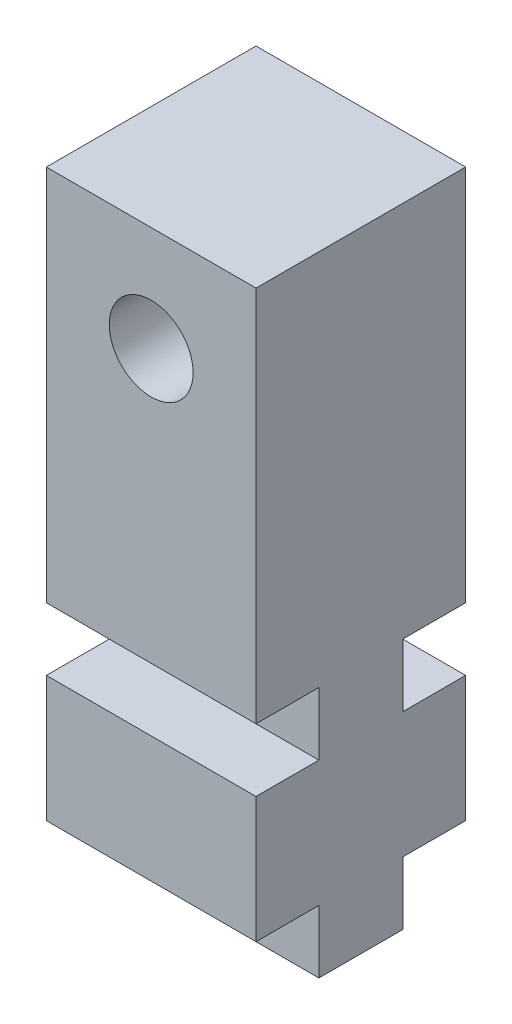
ISO-10303-21;
HEADER;
FILE_DESCRIPTION(('STEP AP214'),'2;1');
FILE_NAME('part.step','',(''),(''),'','','');
FILE_SCHEMA(('AUTOMOTIVE_DESIGN { 1 0 10303 214 1 1 1 1 }'));
ENDSEC;
DATA;
#1=APPLICATION_CONTEXT('core data for automotive mechanical design processes');
#2=APPLICATION_PROTOCOL_DEFINITION('international standard','automotive_design',2000,#1);
#3=PRODUCT_CONTEXT('',#1,'mechanical');
#4=PRODUCT('Part','Part','',(#3));
#5=PRODUCT_RELATED_PRODUCT_CATEGORY('part','',(#4));
#6=PRODUCT_DEFINITION_FORMATION('','',#4);
#7=PRODUCT_DEFINITION_CONTEXT('part definition',#1,'design');
#8=PRODUCT_DEFINITION('design','',#6,#7);
#9=PRODUCT_DEFINITION_SHAPE('','',#8);
#10=(LENGTH_UNIT() NAMED_UNIT(*) SI_UNIT(.MILLI.,.METRE.));
#11=(NAMED_UNIT(*) PLANE_ANGLE_UNIT() SI_UNIT($,.RADIAN.));
#12=(NAMED_UNIT(*) SI_UNIT($,.STERADIAN.) SOLID_ANGLE_UNIT());
#13=UNCERTAINTY_MEASURE_WITH_UNIT(LENGTH_MEASURE(1.E-05),#10,'distance_accuracy_value','');
#14=(GEOMETRIC_REPRESENTATION_CONTEXT(3) GLOBAL_UNCERTAINTY_ASSIGNED_CONTEXT((#13)) GLOBAL_UNIT_ASSIGNED_CONTEXT((#10,
#11,#12)) REPRESENTATION_CONTEXT('',''));
#15=CARTESIAN_POINT('',(0.,0.,0.));
#16=DIRECTION('',(0.,0.,1.));
#17=DIRECTION('',(1.,0.,0.));
#18=AXIS2_PLACEMENT_3D('',#15,#16,#17);
#19=CARTESIAN_POINT('',(0.,0.,-2.5));
#20=DIRECTION('',(0.,0.,1.));
#21=DIRECTION('',(1.,0.,0.));
#22=AXIS2_PLACEMENT_3D('',#19,#20,#21);
#23=PLANE('',#22);
#24=CARTESIAN_POINT('',(0.,4.99999999999998,-2.5));
#25=DIRECTION('',(0.,0.,1.));
#26=DIRECTION('',(1.,0.,0.));
#27=AXIS2_PLACEMENT_3D('',#24,#25,#26);
#28=CIRCLE('',#27,1.);
#29=CARTESIAN_POINT('',(1.,4.99999999999998,-2.5));
#30=VERTEX_POINT('',#29);
#31=EDGE_CURVE('E236',#30,#30,#28,.T.);
#32=ORIENTED_EDGE('',*,*,#31,.T.);
#33=EDGE_LOOP('',(#32));
#34=FACE_BOUND('',#33,.T.);
#35=DIRECTION('',(0.,1.,0.));
#36=VECTOR('',#35,1.);
#37=CARTESIAN_POINT('',(2.5,7.49999999999998,-2.5));
#38=LINE('',#37,#36);
#39=CARTESIAN_POINT('',(2.5,-1.5,-2.5));
#40=VERTEX_POINT('',#39);
#41=CARTESIAN_POINT('',(2.5,7.49999999999998,-2.5));
#42=VERTEX_POINT('',#41);
#43=EDGE_CURVE('E246',#40,#42,#38,.T.);
#44=ORIENTED_EDGE('',*,*,#43,.F.);
#45=DIRECTION('',(1.,0.,0.));
#46=VECTOR('',#45,1.);
#47=CARTESIAN_POINT('',(-2.5,-1.5,-2.5));
#48=LINE('',#47,#46);
#49=CARTESIAN_POINT('',(-2.5,-1.5,-2.5));
#50=VERTEX_POINT('',#49);
#51=EDGE_CURVE('E186',#50,#40,#48,.T.);
#52=ORIENTED_EDGE('',*,*,#51,.F.);
#53=DIRECTION('',(0.,-1.,0.));
#54=VECTOR('',#53,1.);
#55=CARTESIAN_POINT('',(-2.5,7.49999999999998,-2.5));
#56=LINE('',#55,#54);
#57=CARTESIAN_POINT('',(-2.5,7.49999999999998,-2.5));
#58=VERTEX_POINT('',#57);
#59=EDGE_CURVE('E264',#58,#50,#56,.T.);
#60=ORIENTED_EDGE('',*,*,#59,.F.);
#61=DIRECTION('',(-1.,0.,0.));
#62=VECTOR('',#61,1.);
#63=CARTESIAN_POINT('',(-2.5,7.49999999999998,-2.5));
#64=LINE('',#63,#62);
#65=EDGE_CURVE('E261',#42,#58,#64,.T.);
#66=ORIENTED_EDGE('',*,*,#65,.F.);
#67=EDGE_LOOP('',(#44,#52,#60,#66));
#68=FACE_BOUND('',#67,.T.);
#69=ADVANCED_FACE('F33',(#34,#68),#23,.F.);
#70=CARTESIAN_POINT('',(0.,0.,2.5));
#71=DIRECTION('',(0.,0.,1.));
#72=DIRECTION('',(1.,0.,0.));
#73=AXIS2_PLACEMENT_3D('',#70,#71,#72);
#74=PLANE('',#73);
#75=DIRECTION('',(1.,0.,0.));
#76=VECTOR('',#75,1.);
#77=CARTESIAN_POINT('',(-2.5,-1.50000000000001,2.5));
#78=LINE('',#77,#76);
#79=CARTESIAN_POINT('',(-2.5,-1.50000000000001,2.5));
#80=VERTEX_POINT('',#79);
#81=CARTESIAN_POINT('',(2.5,-1.50000000000001,2.5));
#82=VERTEX_POINT('',#81);
#83=EDGE_CURVE('E233',#80,#82,#78,.T.);
#84=ORIENTED_EDGE('',*,*,#83,.T.);
#85=DIRECTION('',(0.,1.,0.));
#86=VECTOR('',#85,1.);
#87=CARTESIAN_POINT('',(2.5,7.49999999999998,2.5));
#88=LINE('',#87,#86);
#89=CARTESIAN_POINT('',(2.5,7.49999999999998,2.5));
#90=VERTEX_POINT('',#89);
#91=EDGE_CURVE('E252',#82,#90,#88,.T.);
#92=ORIENTED_EDGE('',*,*,#91,.T.);
#93=DIRECTION('',(-1.,0.,0.));
#94=VECTOR('',#93,1.);
#95=CARTESIAN_POINT('',(-2.5,7.49999999999998,2.5));
#96=LINE('',#95,#94);
#97=CARTESIAN_POINT('',(-2.5,7.49999999999998,2.5));
#98=VERTEX_POINT('',#97);
#99=EDGE_CURVE('E251',#90,#98,#96,.T.);
#100=ORIENTED_EDGE('',*,*,#99,.T.);
#101=DIRECTION('',(0.,-1.,0.));
#102=VECTOR('',#101,1.);
#103=CARTESIAN_POINT('',(-2.5,7.49999999999998,2.5));
#104=LINE('',#103,#102);
#105=EDGE_CURVE('E255',#98,#80,#104,.T.);
#106=ORIENTED_EDGE('',*,*,#105,.T.);
#107=EDGE_LOOP('',(#84,#92,#100,#106));
#108=FACE_BOUND('',#107,.T.);
#109=CARTESIAN_POINT('',(0.,4.99999999999998,2.5));
#110=DIRECTION('',(0.,0.,1.));
#111=DIRECTION('',(1.,0.,0.));
#112=AXIS2_PLACEMENT_3D('',#109,#110,#111);
#113=CIRCLE('',#112,1.);
#114=CARTESIAN_POINT('',(1.,4.99999999999998,2.5));
#115=VERTEX_POINT('',#114);
#116=EDGE_CURVE('E243',#115,#115,#113,.T.);
#117=ORIENTED_EDGE('',*,*,#116,.F.);
#118=EDGE_LOOP('',(#117));
#119=FACE_BOUND('',#118,.T.);
#120=ADVANCED_FACE('F322',(#108,#119),#74,.T.);
#121=DIRECTION('',(1.,0.,0.));
#122=VECTOR('',#121,1.);
#123=CARTESIAN_POINT('',(-2.5,-6.00000000000001,2.5));
#124=LINE('',#123,#122);
#125=CARTESIAN_POINT('',(-2.5,-6.00000000000001,2.5));
#126=VERTEX_POINT('',#125);
#127=CARTESIAN_POINT('',(2.5,-6.00000000000001,2.5));
#128=VERTEX_POINT('',#127);
#129=EDGE_CURVE('E151',#126,#128,#124,.T.);
#130=ORIENTED_EDGE('',*,*,#129,.T.);
#131=CARTESIAN_POINT('',(2.5,-3.00000000000001,2.5));
#132=VERTEX_POINT('',#131);
#133=EDGE_CURVE('E249',#128,#132,#88,.T.);
#134=ORIENTED_EDGE('',*,*,#133,.T.);
#135=DIRECTION('',(1.,0.,0.));
#136=VECTOR('',#135,1.);
#137=CARTESIAN_POINT('',(-2.5,-3.00000000000001,2.5));
#138=LINE('',#137,#136);
#139=CARTESIAN_POINT('',(-2.5,-3.00000000000001,2.5));
#140=VERTEX_POINT('',#139);
#141=EDGE_CURVE('E226',#140,#132,#138,.T.);
#142=ORIENTED_EDGE('',*,*,#141,.F.);
#143=EDGE_CURVE('E254',#140,#126,#104,.T.);
#144=ORIENTED_EDGE('',*,*,#143,.T.);
#145=EDGE_LOOP('',(#130,#134,#142,#144));
#146=FACE_BOUND('',#145,.T.);
#147=ADVANCED_FACE('F309',(#146),#74,.T.);
#148=CARTESIAN_POINT('',(2.5,-5.99999999999999,-2.5));
#149=VERTEX_POINT('',#148);
#150=CARTESIAN_POINT('',(2.5,-3.,-2.5));
#151=VERTEX_POINT('',#150);
#152=EDGE_CURVE('E260',#149,#151,#38,.T.);
#153=ORIENTED_EDGE('',*,*,#152,.F.);
#154=DIRECTION('',(1.,0.,0.));
#155=VECTOR('',#154,1.);
#156=CARTESIAN_POINT('',(-2.5,-5.99999999999999,-2.5));
#157=LINE('',#156,#155);
#158=CARTESIAN_POINT('',(-2.5,-5.99999999999999,-2.5));
#159=VERTEX_POINT('',#158);
#160=EDGE_CURVE('E171',#159,#149,#157,.T.);
#161=ORIENTED_EDGE('',*,*,#160,.F.);
#162=CARTESIAN_POINT('',(-2.5,-3.,-2.5));
#163=VERTEX_POINT('',#162);
#164=EDGE_CURVE('E263',#163,#159,#56,.T.);
#165=ORIENTED_EDGE('',*,*,#164,.F.);
#166=DIRECTION('',(1.,0.,0.));
#167=VECTOR('',#166,1.);
#168=CARTESIAN_POINT('',(-2.5,-3.,-2.5));
#169=LINE('',#168,#167);
#170=EDGE_CURVE('E210',#163,#151,#169,.T.);
#171=ORIENTED_EDGE('',*,*,#170,.T.);
#172=EDGE_LOOP('',(#153,#161,#165,#171));
#173=FACE_BOUND('',#172,.T.);
#174=ADVANCED_FACE('F296',(#173),#23,.F.);
#175=CARTESIAN_POINT('',(2.5,7.49999999999998,2.5));
#176=DIRECTION('',(-1.,0.,0.));
#177=DIRECTION('',(0.,-1.,0.));
#178=AXIS2_PLACEMENT_3D('',#175,#176,#177);
#179=PLANE('',#178);
#180=ORIENTED_EDGE('',*,*,#133,.F.);
#181=DIRECTION('',(0.,0.,1.));
#182=VECTOR('',#181,1.);
#183=CARTESIAN_POINT('',(2.5,-6.00000000000001,2.5));
#184=LINE('',#183,#182);
#185=CARTESIAN_POINT('',(2.5,-6.00000000000001,1.));
#186=VERTEX_POINT('',#185);
#187=EDGE_CURVE('E167',#186,#128,#184,.T.);
#188=ORIENTED_EDGE('',*,*,#187,.F.);
#189=DIRECTION('',(0.,1.,0.));
#190=VECTOR('',#189,1.);
#191=CARTESIAN_POINT('',(2.5,-6.00000000000001,1.));
#192=LINE('',#191,#190);
#193=CARTESIAN_POINT('',(2.5,-7.50000000000001,1.));
#194=VERTEX_POINT('',#193);
#195=EDGE_CURVE('E148',#194,#186,#192,.T.);
#196=ORIENTED_EDGE('',*,*,#195,.F.);
#197=DIRECTION('',(0.,0.,-1.));
#198=VECTOR('',#197,1.);
#199=CARTESIAN_POINT('',(2.5,-7.50000000000001,2.5));
#200=LINE('',#199,#198);
#201=CARTESIAN_POINT('',(2.5,-7.50000000000001,-1.));
#202=VERTEX_POINT('',#201);
#203=EDGE_CURVE('E258',#194,#202,#200,.T.);
#204=ORIENTED_EDGE('',*,*,#203,.T.);
#205=DIRECTION('',(0.,-1.,0.));
#206=VECTOR('',#205,1.);
#207=CARTESIAN_POINT('',(2.5,-5.99999999999999,-1.));
#208=LINE('',#207,#206);
#209=CARTESIAN_POINT('',(2.5,-5.99999999999999,-1.));
#210=VERTEX_POINT('',#209);
#211=EDGE_CURVE('E180',#210,#202,#208,.T.);
#212=ORIENTED_EDGE('',*,*,#211,.F.);
#213=DIRECTION('',(0.,0.,1.));
#214=VECTOR('',#213,1.);
#215=CARTESIAN_POINT('',(2.5,-5.99999999999999,-2.5));
#216=LINE('',#215,#214);
#217=EDGE_CURVE('E183',#149,#210,#216,.T.);
#218=ORIENTED_EDGE('',*,*,#217,.F.);
#219=ORIENTED_EDGE('',*,*,#152,.T.);
#220=DIRECTION('',(0.,0.,-1.));
#221=VECTOR('',#220,1.);
#222=CARTESIAN_POINT('',(2.5,-3.,-2.5));
#223=LINE('',#222,#221);
#224=CARTESIAN_POINT('',(2.5,-3.,-1.));
#225=VERTEX_POINT('',#224);
#226=EDGE_CURVE('E197',#225,#151,#223,.T.);
#227=ORIENTED_EDGE('',*,*,#226,.F.);
#228=DIRECTION('',(0.,-1.,0.));
#229=VECTOR('',#228,1.);
#230=CARTESIAN_POINT('',(2.5,-1.5,-1.));
#231=LINE('',#230,#229);
#232=CARTESIAN_POINT('',(2.5,-1.5,-1.));
#233=VERTEX_POINT('',#232);
#234=EDGE_CURVE('E205',#233,#225,#231,.T.);
#235=ORIENTED_EDGE('',*,*,#234,.F.);
#236=DIRECTION('',(0.,0.,1.));
#237=VECTOR('',#236,1.);
#238=CARTESIAN_POINT('',(2.5,-1.5,-2.5));
#239=LINE('',#238,#237);
#240=EDGE_CURVE('E202',#40,#233,#239,.T.);
#241=ORIENTED_EDGE('',*,*,#240,.F.);
#242=ORIENTED_EDGE('',*,*,#43,.T.);
#243=DIRECTION('',(0.,0.,-1.));
#244=VECTOR('',#243,1.);
#245=CARTESIAN_POINT('',(2.5,7.49999999999998,2.5));
#246=LINE('',#245,#244);
#247=EDGE_CURVE('E11',#90,#42,#246,.T.);
#248=ORIENTED_EDGE('',*,*,#247,.F.);
#249=ORIENTED_EDGE('',*,*,#91,.F.);
#250=DIRECTION('',(0.,0.,1.));
#251=VECTOR('',#250,1.);
#252=CARTESIAN_POINT('',(2.5,-1.50000000000001,2.5));
#253=LINE('',#252,#251);
#254=CARTESIAN_POINT('',(2.5,-1.50000000000001,1.));
#255=VERTEX_POINT('',#254);
#256=EDGE_CURVE('E220',#255,#82,#253,.T.);
#257=ORIENTED_EDGE('',*,*,#256,.F.);
#258=DIRECTION('',(0.,1.,0.));
#259=VECTOR('',#258,1.);
#260=CARTESIAN_POINT('',(2.5,-1.50000000000001,1.));
#261=LINE('',#260,#259);
#262=CARTESIAN_POINT('',(2.5,-3.00000000000001,1.));
#263=VERTEX_POINT('',#262);
#264=EDGE_CURVE('E229',#263,#255,#261,.T.);
#265=ORIENTED_EDGE('',*,*,#264,.F.);
#266=DIRECTION('',(0.,0.,-1.));
#267=VECTOR('',#266,1.);
#268=CARTESIAN_POINT('',(2.5,-3.00000000000001,2.5));
#269=LINE('',#268,#267);
#270=EDGE_CURVE('E173',#132,#263,#269,.T.);
#271=ORIENTED_EDGE('',*,*,#270,.F.);
#272=EDGE_LOOP('',(#180,#188,#196,#204,#212,#218,#219,#227,#235,#241,#242,#248,#249,#257,#265,#271));
#273=FACE_BOUND('',#272,.T.);
#274=ADVANCED_FACE('F35',(#273),#179,.F.);
#275=CARTESIAN_POINT('',(-2.5,7.49999999999998,2.5));
#276=DIRECTION('',(0.,-1.,0.));
#277=DIRECTION('',(0.,0.,-1.));
#278=AXIS2_PLACEMENT_3D('',#275,#276,#277);
#279=PLANE('',#278);
#280=ORIENTED_EDGE('',*,*,#65,.T.);
#281=DIRECTION('',(0.,0.,-1.));
#282=VECTOR('',#281,1.);
#283=CARTESIAN_POINT('',(-2.5,7.49999999999998,2.5));
#284=LINE('',#283,#282);
#285=EDGE_CURVE('E41',#98,#58,#284,.T.);
#286=ORIENTED_EDGE('',*,*,#285,.F.);
#287=ORIENTED_EDGE('',*,*,#99,.F.);
#288=ORIENTED_EDGE('',*,*,#247,.T.);
#289=EDGE_LOOP('',(#280,#286,#287,#288));
#290=FACE_BOUND('',#289,.T.);
#291=ADVANCED_FACE('F325',(#290),#279,.F.);
#292=CARTESIAN_POINT('',(-2.5,7.49999999999998,2.5));
#293=DIRECTION('',(1.,0.,0.));
#294=DIRECTION('',(0.,1.,0.));
#295=AXIS2_PLACEMENT_3D('',#292,#293,#294);
#296=PLANE('',#295);
#297=DIRECTION('',(0.,1.,0.));
#298=VECTOR('',#297,1.);
#299=CARTESIAN_POINT('',(-2.5,-6.00000000000001,1.));
#300=LINE('',#299,#298);
#301=CARTESIAN_POINT('',(-2.5,-7.50000000000001,1.));
#302=VERTEX_POINT('',#301);
#303=CARTESIAN_POINT('',(-2.5,-6.00000000000001,1.));
#304=VERTEX_POINT('',#303);
#305=EDGE_CURVE('E56',#302,#304,#300,.T.);
#306=ORIENTED_EDGE('',*,*,#305,.T.);
#307=DIRECTION('',(0.,0.,1.));
#308=VECTOR('',#307,1.);
#309=CARTESIAN_POINT('',(-2.5,-6.00000000000001,2.5));
#310=LINE('',#309,#308);
#311=EDGE_CURVE('E155',#304,#126,#310,.T.);
#312=ORIENTED_EDGE('',*,*,#311,.T.);
#313=ORIENTED_EDGE('',*,*,#143,.F.);
#314=DIRECTION('',(0.,0.,-1.));
#315=VECTOR('',#314,1.);
#316=CARTESIAN_POINT('',(-2.5,-3.00000000000001,2.5));
#317=LINE('',#316,#315);
#318=CARTESIAN_POINT('',(-2.5,-3.00000000000001,1.));
#319=VERTEX_POINT('',#318);
#320=EDGE_CURVE('E216',#140,#319,#317,.T.);
#321=ORIENTED_EDGE('',*,*,#320,.T.);
#322=DIRECTION('',(0.,1.,0.));
#323=VECTOR('',#322,1.);
#324=CARTESIAN_POINT('',(-2.5,-1.50000000000001,1.));
#325=LINE('',#324,#323);
#326=CARTESIAN_POINT('',(-2.5,-1.50000000000001,1.));
#327=VERTEX_POINT('',#326);
#328=EDGE_CURVE('E219',#319,#327,#325,.T.);
#329=ORIENTED_EDGE('',*,*,#328,.T.);
#330=DIRECTION('',(0.,0.,1.));
#331=VECTOR('',#330,1.);
#332=CARTESIAN_POINT('',(-2.5,-1.50000000000001,2.5));
#333=LINE('',#332,#331);
#334=EDGE_CURVE('E223',#327,#80,#333,.T.);
#335=ORIENTED_EDGE('',*,*,#334,.T.);
#336=ORIENTED_EDGE('',*,*,#105,.F.);
#337=ORIENTED_EDGE('',*,*,#285,.T.);
#338=ORIENTED_EDGE('',*,*,#59,.T.);
#339=DIRECTION('',(0.,0.,1.));
#340=VECTOR('',#339,1.);
#341=CARTESIAN_POINT('',(-2.5,-1.5,-2.5));
#342=LINE('',#341,#340);
#343=CARTESIAN_POINT('',(-2.5,-1.5,-1.));
#344=VERTEX_POINT('',#343);
#345=EDGE_CURVE('E193',#50,#344,#342,.T.);
#346=ORIENTED_EDGE('',*,*,#345,.T.);
#347=DIRECTION('',(0.,-1.,0.));
#348=VECTOR('',#347,1.);
#349=CARTESIAN_POINT('',(-2.5,-1.5,-1.));
#350=LINE('',#349,#348);
#351=CARTESIAN_POINT('',(-2.5,-3.,-1.));
#352=VERTEX_POINT('',#351);
#353=EDGE_CURVE('E196',#344,#352,#350,.T.);
#354=ORIENTED_EDGE('',*,*,#353,.T.);
#355=DIRECTION('',(0.,0.,-1.));
#356=VECTOR('',#355,1.);
#357=CARTESIAN_POINT('',(-2.5,-3.,-2.5));
#358=LINE('',#357,#356);
#359=EDGE_CURVE('E48',#352,#163,#358,.T.);
#360=ORIENTED_EDGE('',*,*,#359,.T.);
#361=ORIENTED_EDGE('',*,*,#164,.T.);
#362=DIRECTION('',(0.,0.,1.));
#363=VECTOR('',#362,1.);
#364=CARTESIAN_POINT('',(-2.5,-5.99999999999999,-2.5));
#365=LINE('',#364,#363);
#366=CARTESIAN_POINT('',(-2.5,-5.99999999999999,-1.));
#367=VERTEX_POINT('',#366);
#368=EDGE_CURVE('E176',#159,#367,#365,.T.);
#369=ORIENTED_EDGE('',*,*,#368,.T.);
#370=DIRECTION('',(0.,-1.,0.));
#371=VECTOR('',#370,1.);
#372=CARTESIAN_POINT('',(-2.5,-5.99999999999999,-1.));
#373=LINE('',#372,#371);
#374=CARTESIAN_POINT('',(-2.5,-7.49999999999999,-1.));
#375=VERTEX_POINT('',#374);
#376=EDGE_CURVE('E179',#367,#375,#373,.T.);
#377=ORIENTED_EDGE('',*,*,#376,.T.);
#378=DIRECTION('',(0.,0.,-1.));
#379=VECTOR('',#378,1.);
#380=CARTESIAN_POINT('',(-2.5,-7.50000000000001,2.5));
#381=LINE('',#380,#379);
#382=EDGE_CURVE('E166',#302,#375,#381,.T.);
#383=ORIENTED_EDGE('',*,*,#382,.F.);
#384=EDGE_LOOP('',(#306,#312,#313,#321,#329,#335,#336,#337,#338,#346,#354,#360,#361,#369,#377,#383));
#385=FACE_BOUND('',#384,.T.);
#386=ADVANCED_FACE('F163',(#385),#296,.F.);
#387=CARTESIAN_POINT('',(-2.5,-7.50000000000001,2.5));
#388=DIRECTION('',(0.,1.,0.));
#389=DIRECTION('',(0.,0.,1.));
#390=AXIS2_PLACEMENT_3D('',#387,#388,#389);
#391=PLANE('',#390);
#392=ORIENTED_EDGE('',*,*,#203,.F.);
#393=DIRECTION('',(1.,0.,0.));
#394=VECTOR('',#393,1.);
#395=CARTESIAN_POINT('',(-2.5,-7.50000000000001,1.));
#396=LINE('',#395,#394);
#397=EDGE_CURVE('E152',#302,#194,#396,.T.);
#398=ORIENTED_EDGE('',*,*,#397,.F.);
#399=ORIENTED_EDGE('',*,*,#382,.T.);
#400=DIRECTION('',(1.,0.,0.));
#401=VECTOR('',#400,1.);
#402=CARTESIAN_POINT('',(-2.5,-7.49999999999999,-1.));
#403=LINE('',#402,#401);
#404=EDGE_CURVE('E189',#375,#202,#403,.T.);
#405=ORIENTED_EDGE('',*,*,#404,.T.);
#406=EDGE_LOOP('',(#392,#398,#399,#405));
#407=FACE_BOUND('',#406,.T.);
#408=ADVANCED_FACE('F306',(#407),#391,.F.);
#409=CARTESIAN_POINT('',(0.,4.99999999999998,2.5));
#410=DIRECTION('',(0.,0.,-1.));
#411=DIRECTION('',(-1.,0.,0.));
#412=AXIS2_PLACEMENT_3D('',#409,#410,#411);
#413=CYLINDRICAL_SURFACE('',#412,1.);
#414=ORIENTED_EDGE('',*,*,#116,.T.);
#415=EDGE_LOOP('',(#414));
#416=FACE_BOUND('',#415,.T.);
#417=ORIENTED_EDGE('',*,*,#31,.F.);
#418=EDGE_LOOP('',(#417));
#419=FACE_BOUND('',#418,.T.);
#420=ADVANCED_FACE('F347',(#416,#419),#413,.F.);
#421=CARTESIAN_POINT('',(-2.5,-1.50000000000001,2.5));
#422=DIRECTION('',(0.,1.,0.));
#423=DIRECTION('',(-1.,0.,0.));
#424=AXIS2_PLACEMENT_3D('',#421,#422,#423);
#425=PLANE('',#424);
#426=ORIENTED_EDGE('',*,*,#256,.T.);
#427=ORIENTED_EDGE('',*,*,#83,.F.);
#428=ORIENTED_EDGE('',*,*,#334,.F.);
#429=DIRECTION('',(1.,0.,0.));
#430=VECTOR('',#429,1.);
#431=CARTESIAN_POINT('',(-2.5,-1.50000000000001,1.));
#432=LINE('',#431,#430);
#433=EDGE_CURVE('E237',#327,#255,#432,.T.);
#434=ORIENTED_EDGE('',*,*,#433,.T.);
#435=EDGE_LOOP('',(#426,#427,#428,#434));
#436=FACE_BOUND('',#435,.T.);
#437=ADVANCED_FACE('F320',(#436),#425,.F.);
#438=CARTESIAN_POINT('',(-2.5,-1.50000000000001,1.));
#439=DIRECTION('',(0.,0.,-1.));
#440=DIRECTION('',(-1.,0.,0.));
#441=AXIS2_PLACEMENT_3D('',#438,#439,#440);
#442=PLANE('',#441);
#443=ORIENTED_EDGE('',*,*,#264,.T.);
#444=ORIENTED_EDGE('',*,*,#433,.F.);
#445=ORIENTED_EDGE('',*,*,#328,.F.);
#446=DIRECTION('',(1.,0.,0.));
#447=VECTOR('',#446,1.);
#448=CARTESIAN_POINT('',(-2.5,-3.00000000000001,1.));
#449=LINE('',#448,#447);
#450=EDGE_CURVE('E239',#319,#263,#449,.T.);
#451=ORIENTED_EDGE('',*,*,#450,.T.);
#452=EDGE_LOOP('',(#443,#444,#445,#451));
#453=FACE_BOUND('',#452,.T.);
#454=ADVANCED_FACE('F316',(#453),#442,.F.);
#455=CARTESIAN_POINT('',(-2.5,-3.00000000000001,2.5));
#456=DIRECTION('',(0.,-1.,0.));
#457=DIRECTION('',(1.,0.,0.));
#458=AXIS2_PLACEMENT_3D('',#455,#456,#457);
#459=PLANE('',#458);
#460=ORIENTED_EDGE('',*,*,#270,.T.);
#461=ORIENTED_EDGE('',*,*,#450,.F.);
#462=ORIENTED_EDGE('',*,*,#320,.F.);
#463=ORIENTED_EDGE('',*,*,#141,.T.);
#464=EDGE_LOOP('',(#460,#461,#462,#463));
#465=FACE_BOUND('',#464,.T.);
#466=ADVANCED_FACE('F313',(#465),#459,.F.);
#467=CARTESIAN_POINT('',(-2.5,-5.99999999999999,-2.5));
#468=DIRECTION('',(0.,1.,0.));
#469=DIRECTION('',(-1.,0.,0.));
#470=AXIS2_PLACEMENT_3D('',#467,#468,#469);
#471=PLANE('',#470);
#472=ORIENTED_EDGE('',*,*,#217,.T.);
#473=DIRECTION('',(1.,0.,0.));
#474=VECTOR('',#473,1.);
#475=CARTESIAN_POINT('',(-2.5,-5.99999999999999,-1.));
#476=LINE('',#475,#474);
#477=EDGE_CURVE('E182',#367,#210,#476,.T.);
#478=ORIENTED_EDGE('',*,*,#477,.F.);
#479=ORIENTED_EDGE('',*,*,#368,.F.);
#480=ORIENTED_EDGE('',*,*,#160,.T.);
#481=EDGE_LOOP('',(#472,#478,#479,#480));
#482=FACE_BOUND('',#481,.T.);
#483=ADVANCED_FACE('F299',(#482),#471,.F.);
#484=CARTESIAN_POINT('',(-2.5,-5.99999999999999,-1.));
#485=DIRECTION('',(0.,0.,1.));
#486=DIRECTION('',(0.,-1.,0.));
#487=AXIS2_PLACEMENT_3D('',#484,#485,#486);
#488=PLANE('',#487);
#489=ORIENTED_EDGE('',*,*,#211,.T.);
#490=ORIENTED_EDGE('',*,*,#404,.F.);
#491=ORIENTED_EDGE('',*,*,#376,.F.);
#492=ORIENTED_EDGE('',*,*,#477,.T.);
#493=EDGE_LOOP('',(#489,#490,#491,#492));
#494=FACE_BOUND('',#493,.T.);
#495=ADVANCED_FACE('F303',(#494),#488,.F.);
#496=CARTESIAN_POINT('',(-2.5,-6.00000000000001,2.5));
#497=DIRECTION('',(0.,1.,0.));
#498=DIRECTION('',(-1.,0.,0.));
#499=AXIS2_PLACEMENT_3D('',#496,#497,#498);
#500=PLANE('',#499);
#501=ORIENTED_EDGE('',*,*,#187,.T.);
#502=ORIENTED_EDGE('',*,*,#129,.F.);
#503=ORIENTED_EDGE('',*,*,#311,.F.);
#504=DIRECTION('',(1.,0.,0.));
#505=VECTOR('',#504,1.);
#506=CARTESIAN_POINT('',(-2.5,-6.00000000000001,1.));
#507=LINE('',#506,#505);
#508=EDGE_CURVE('E144',#304,#186,#507,.T.);
#509=ORIENTED_EDGE('',*,*,#508,.T.);
#510=EDGE_LOOP('',(#501,#502,#503,#509));
#511=FACE_BOUND('',#510,.T.);
#512=ADVANCED_FACE('F156',(#511),#500,.F.);
#513=CARTESIAN_POINT('',(-2.5,-6.00000000000001,1.));
#514=DIRECTION('',(0.,0.,-1.));
#515=DIRECTION('',(0.,1.,0.));
#516=AXIS2_PLACEMENT_3D('',#513,#514,#515);
#517=PLANE('',#516);
#518=ORIENTED_EDGE('',*,*,#195,.T.);
#519=ORIENTED_EDGE('',*,*,#508,.F.);
#520=ORIENTED_EDGE('',*,*,#305,.F.);
#521=ORIENTED_EDGE('',*,*,#397,.T.);
#522=EDGE_LOOP('',(#518,#519,#520,#521));
#523=FACE_BOUND('',#522,.T.);
#524=ADVANCED_FACE('F146',(#523),#517,.F.);
#525=CARTESIAN_POINT('',(-2.5,-1.5,-2.5));
#526=DIRECTION('',(0.,1.,0.));
#527=DIRECTION('',(-1.,0.,0.));
#528=AXIS2_PLACEMENT_3D('',#525,#526,#527);
#529=PLANE('',#528);
#530=ORIENTED_EDGE('',*,*,#240,.T.);
#531=DIRECTION('',(1.,0.,0.));
#532=VECTOR('',#531,1.);
#533=CARTESIAN_POINT('',(-2.5,-1.5,-1.));
#534=LINE('',#533,#532);
#535=EDGE_CURVE('E201',#344,#233,#534,.T.);
#536=ORIENTED_EDGE('',*,*,#535,.F.);
#537=ORIENTED_EDGE('',*,*,#345,.F.);
#538=ORIENTED_EDGE('',*,*,#51,.T.);
#539=EDGE_LOOP('',(#530,#536,#537,#538));
#540=FACE_BOUND('',#539,.T.);
#541=ADVANCED_FACE('F281',(#540),#529,.F.);
#542=CARTESIAN_POINT('',(-2.5,-3.,-2.5));
#543=DIRECTION('',(0.,-1.,0.));
#544=DIRECTION('',(1.,0.,0.));
#545=AXIS2_PLACEMENT_3D('',#542,#543,#544);
#546=PLANE('',#545);
#547=ORIENTED_EDGE('',*,*,#226,.T.);
#548=ORIENTED_EDGE('',*,*,#170,.F.);
#549=ORIENTED_EDGE('',*,*,#359,.F.);
#550=DIRECTION('',(1.,0.,0.));
#551=VECTOR('',#550,1.);
#552=CARTESIAN_POINT('',(-2.5,-3.,-1.));
#553=LINE('',#552,#551);
#554=EDGE_CURVE('E213',#352,#225,#553,.T.);
#555=ORIENTED_EDGE('',*,*,#554,.T.);
#556=EDGE_LOOP('',(#547,#548,#549,#555));
#557=FACE_BOUND('',#556,.T.);
#558=ADVANCED_FACE('F359',(#557),#546,.F.);
#559=CARTESIAN_POINT('',(-2.5,-1.5,-1.));
#560=DIRECTION('',(0.,0.,1.));
#561=DIRECTION('',(1.,0.,0.));
#562=AXIS2_PLACEMENT_3D('',#559,#560,#561);
#563=PLANE('',#562);
#564=ORIENTED_EDGE('',*,*,#234,.T.);
#565=ORIENTED_EDGE('',*,*,#554,.F.);
#566=ORIENTED_EDGE('',*,*,#353,.F.);
#567=ORIENTED_EDGE('',*,*,#535,.T.);
#568=EDGE_LOOP('',(#564,#565,#566,#567));
#569=FACE_BOUND('',#568,.T.);
#570=ADVANCED_FACE('F289',(#569),#563,.F.);
#571=CLOSED_SHELL('',(#69,#120,#147,#174,#274,#291,#386,#408,#420,#437,#454,#466,#483,#495,#512,
#524,#541,#558,#570));
#572=MANIFOLD_SOLID_BREP('B2',#571);
#573=ADVANCED_BREP_SHAPE_REPRESENTATION('',(#18,#572),#14);
#574=SHAPE_DEFINITION_REPRESENTATION(#9,#573);
ENDSEC;
END-ISO-10303-21;
